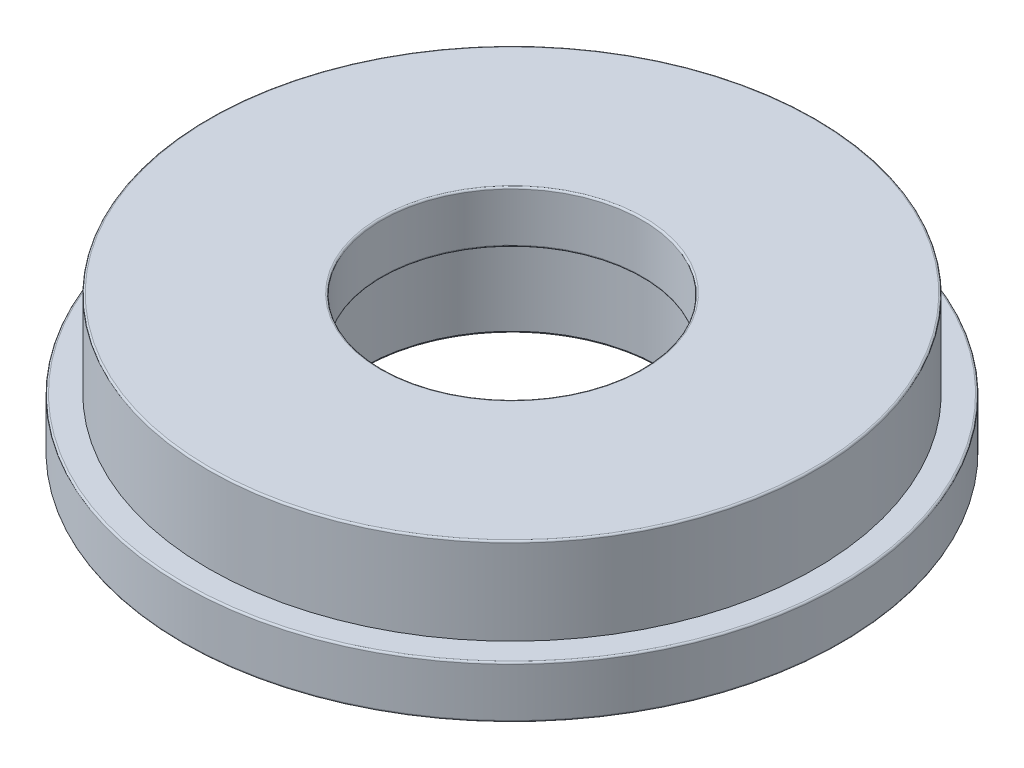
ISO-10303-21;
HEADER;
FILE_DESCRIPTION(('STEP AP214'),'2;1');
FILE_NAME('part.step','',(''),(''),'','','');
FILE_SCHEMA(('AUTOMOTIVE_DESIGN { 1 0 10303 214 1 1 1 1 }'));
ENDSEC;
DATA;
#1=APPLICATION_CONTEXT('core data for automotive mechanical design processes');
#2=APPLICATION_PROTOCOL_DEFINITION('international standard','automotive_design',2000,#1);
#3=PRODUCT_CONTEXT('',#1,'mechanical');
#4=PRODUCT('Part','Part','',(#3));
#5=PRODUCT_RELATED_PRODUCT_CATEGORY('part','',(#4));
#6=PRODUCT_DEFINITION_FORMATION('','',#4);
#7=PRODUCT_DEFINITION_CONTEXT('part definition',#1,'design');
#8=PRODUCT_DEFINITION('design','',#6,#7);
#9=PRODUCT_DEFINITION_SHAPE('','',#8);
#10=(LENGTH_UNIT() NAMED_UNIT(*) SI_UNIT(.MILLI.,.METRE.));
#11=(NAMED_UNIT(*) PLANE_ANGLE_UNIT() SI_UNIT($,.RADIAN.));
#12=(NAMED_UNIT(*) SI_UNIT($,.STERADIAN.) SOLID_ANGLE_UNIT());
#13=UNCERTAINTY_MEASURE_WITH_UNIT(LENGTH_MEASURE(1.E-05),#10,'distance_accuracy_value','');
#14=(GEOMETRIC_REPRESENTATION_CONTEXT(3) GLOBAL_UNCERTAINTY_ASSIGNED_CONTEXT((#13)) GLOBAL_UNIT_ASSIGNED_CONTEXT((#10,
#11,#12)) REPRESENTATION_CONTEXT('',''));
#15=CARTESIAN_POINT('',(0.,0.,0.));
#16=DIRECTION('',(0.,0.,1.));
#17=DIRECTION('',(1.,0.,0.));
#18=AXIS2_PLACEMENT_3D('',#15,#16,#17);
#19=CARTESIAN_POINT('',(0.,3.,0.));
#20=DIRECTION('',(0.,-1.,0.));
#21=DIRECTION('',(0.,0.,-1.));
#22=AXIS2_PLACEMENT_3D('',#19,#20,#21);
#23=CYLINDRICAL_SURFACE('',#22,19.);
#24=CARTESIAN_POINT('',(0.,0.0999999999999998,0.));
#25=DIRECTION('',(0.,1.,0.));
#26=DIRECTION('',(0.,0.,1.));
#27=AXIS2_PLACEMENT_3D('',#24,#25,#26);
#28=CIRCLE('',#27,19.);
#29=CARTESIAN_POINT('',(0.,0.0999999999999998,19.));
#30=VERTEX_POINT('',#29);
#31=EDGE_CURVE('E46',#30,#30,#28,.T.);
#32=ORIENTED_EDGE('',*,*,#31,.T.);
#33=EDGE_LOOP('',(#32));
#34=FACE_BOUND('',#33,.T.);
#35=CARTESIAN_POINT('',(0.,2.9,0.));
#36=DIRECTION('',(0.,1.,0.));
#37=DIRECTION('',(0.,0.,1.));
#38=AXIS2_PLACEMENT_3D('',#35,#36,#37);
#39=CIRCLE('',#38,19.);
#40=CARTESIAN_POINT('',(0.,2.9,19.));
#41=VERTEX_POINT('',#40);
#42=EDGE_CURVE('E50',#41,#41,#39,.F.);
#43=ORIENTED_EDGE('',*,*,#42,.T.);
#44=EDGE_LOOP('',(#43));
#45=FACE_BOUND('',#44,.T.);
#46=ADVANCED_FACE('F39',(#34,#45),#23,.T.);
#47=CARTESIAN_POINT('',(0.,3.,0.));
#48=DIRECTION('',(0.,1.,0.));
#49=DIRECTION('',(0.,0.,1.));
#50=AXIS2_PLACEMENT_3D('',#47,#48,#49);
#51=PLANE('',#50);
#52=CARTESIAN_POINT('',(0.,3.,0.));
#53=DIRECTION('',(0.,1.,0.));
#54=DIRECTION('',(0.,0.,1.));
#55=AXIS2_PLACEMENT_3D('',#52,#53,#54);
#56=CIRCLE('',#55,18.9);
#57=CARTESIAN_POINT('',(0.,3.,18.9));
#58=VERTEX_POINT('',#57);
#59=EDGE_CURVE('E11',#58,#58,#56,.T.);
#60=ORIENTED_EDGE('',*,*,#59,.T.);
#61=EDGE_LOOP('',(#60));
#62=FACE_BOUND('',#61,.T.);
#63=CARTESIAN_POINT('',(0.,3.,0.));
#64=DIRECTION('',(0.,1.,0.));
#65=DIRECTION('',(0.,0.,1.));
#66=AXIS2_PLACEMENT_3D('',#63,#64,#65);
#67=CIRCLE('',#66,17.5);
#68=CARTESIAN_POINT('',(0.,3.,17.5));
#69=VERTEX_POINT('',#68);
#70=EDGE_CURVE('E127',#69,#69,#67,.T.);
#71=ORIENTED_EDGE('',*,*,#70,.F.);
#72=EDGE_LOOP('',(#71));
#73=FACE_BOUND('',#72,.T.);
#74=ADVANCED_FACE('F162',(#62,#73),#51,.T.);
#75=CARTESIAN_POINT('',(0.,0.,0.));
#76=DIRECTION('',(0.,1.,0.));
#77=DIRECTION('',(0.,0.,1.));
#78=AXIS2_PLACEMENT_3D('',#75,#76,#77);
#79=PLANE('',#78);
#80=CARTESIAN_POINT('',(-12.9903810567666,0.,-7.49999999999999));
#81=DIRECTION('',(0.,1.,0.));
#82=DIRECTION('',(0.,0.,1.));
#83=AXIS2_PLACEMENT_3D('',#80,#81,#82);
#84=CIRCLE('',#83,3.15);
#85=CARTESIAN_POINT('',(-12.9903810567666,0.,-4.34999999999999));
#86=VERTEX_POINT('',#85);
#87=EDGE_CURVE('E86',#86,#86,#84,.T.);
#88=ORIENTED_EDGE('',*,*,#87,.T.);
#89=EDGE_LOOP('',(#88));
#90=FACE_BOUND('',#89,.T.);
#91=CARTESIAN_POINT('',(-12.9903810567666,0.,7.50000000000001));
#92=DIRECTION('',(0.,1.,0.));
#93=DIRECTION('',(0.,0.,1.));
#94=AXIS2_PLACEMENT_3D('',#91,#92,#93);
#95=CIRCLE('',#94,3.15);
#96=CARTESIAN_POINT('',(-12.9903810567666,0.,10.65));
#97=VERTEX_POINT('',#96);
#98=EDGE_CURVE('E89',#97,#97,#95,.T.);
#99=ORIENTED_EDGE('',*,*,#98,.T.);
#100=EDGE_LOOP('',(#99));
#101=FACE_BOUND('',#100,.T.);
#102=CARTESIAN_POINT('',(0.,0.,15.));
#103=DIRECTION('',(0.,1.,0.));
#104=DIRECTION('',(0.,0.,1.));
#105=AXIS2_PLACEMENT_3D('',#102,#103,#104);
#106=CIRCLE('',#105,3.15);
#107=CARTESIAN_POINT('',(0.,0.,18.15));
#108=VERTEX_POINT('',#107);
#109=EDGE_CURVE('E92',#108,#108,#106,.T.);
#110=ORIENTED_EDGE('',*,*,#109,.T.);
#111=EDGE_LOOP('',(#110));
#112=FACE_BOUND('',#111,.T.);
#113=CARTESIAN_POINT('',(12.9903810567666,0.,7.5));
#114=DIRECTION('',(0.,1.,0.));
#115=DIRECTION('',(0.,0.,1.));
#116=AXIS2_PLACEMENT_3D('',#113,#114,#115);
#117=CIRCLE('',#116,3.15);
#118=CARTESIAN_POINT('',(12.9903810567666,0.,10.65));
#119=VERTEX_POINT('',#118);
#120=EDGE_CURVE('E95',#119,#119,#117,.T.);
#121=ORIENTED_EDGE('',*,*,#120,.T.);
#122=EDGE_LOOP('',(#121));
#123=FACE_BOUND('',#122,.T.);
#124=CARTESIAN_POINT('',(12.9903810567666,0.,-7.50000000000001));
#125=DIRECTION('',(0.,1.,0.));
#126=DIRECTION('',(0.,0.,1.));
#127=AXIS2_PLACEMENT_3D('',#124,#125,#126);
#128=CIRCLE('',#127,3.15);
#129=CARTESIAN_POINT('',(12.9903810567666,0.,-4.35));
#130=VERTEX_POINT('',#129);
#131=EDGE_CURVE('E98',#130,#130,#128,.T.);
#132=ORIENTED_EDGE('',*,*,#131,.T.);
#133=EDGE_LOOP('',(#132));
#134=FACE_BOUND('',#133,.T.);
#135=CARTESIAN_POINT('',(0.,0.,-15.));
#136=DIRECTION('',(0.,1.,0.));
#137=DIRECTION('',(0.,0.,1.));
#138=AXIS2_PLACEMENT_3D('',#135,#136,#137);
#139=CIRCLE('',#138,3.15);
#140=CARTESIAN_POINT('',(0.,0.,-11.85));
#141=VERTEX_POINT('',#140);
#142=EDGE_CURVE('E101',#141,#141,#139,.T.);
#143=ORIENTED_EDGE('',*,*,#142,.T.);
#144=EDGE_LOOP('',(#143));
#145=FACE_BOUND('',#144,.T.);
#146=CARTESIAN_POINT('',(0.,0.,0.));
#147=DIRECTION('',(0.,1.,0.));
#148=DIRECTION('',(0.,0.,1.));
#149=AXIS2_PLACEMENT_3D('',#146,#147,#148);
#150=CIRCLE('',#149,8.6);
#151=CARTESIAN_POINT('',(0.,0.,8.6));
#152=VERTEX_POINT('',#151);
#153=EDGE_CURVE('E104',#152,#152,#150,.T.);
#154=ORIENTED_EDGE('',*,*,#153,.T.);
#155=EDGE_LOOP('',(#154));
#156=FACE_BOUND('',#155,.T.);
#157=CARTESIAN_POINT('',(0.,0.,0.));
#158=DIRECTION('',(0.,1.,0.));
#159=DIRECTION('',(0.,0.,1.));
#160=AXIS2_PLACEMENT_3D('',#157,#158,#159);
#161=CIRCLE('',#160,18.9);
#162=CARTESIAN_POINT('',(0.,0.,18.9));
#163=VERTEX_POINT('',#162);
#164=EDGE_CURVE('E107',#163,#163,#161,.F.);
#165=ORIENTED_EDGE('',*,*,#164,.T.);
#166=EDGE_LOOP('',(#165));
#167=FACE_BOUND('',#166,.T.);
#168=ADVANCED_FACE('F167',(#90,#101,#112,#123,#134,#145,#156,#167),#79,.F.);
#169=CARTESIAN_POINT('',(-12.9903810567666,1.7,-7.49999999999999));
#170=DIRECTION('',(0.,-1.,0.));
#171=DIRECTION('',(0.,0.,-1.));
#172=AXIS2_PLACEMENT_3D('',#169,#170,#171);
#173=CYLINDRICAL_SURFACE('',#172,3.05);
#174=CARTESIAN_POINT('',(-12.9903810567666,0.1,-7.49999999999999));
#175=DIRECTION('',(0.,1.,0.));
#176=DIRECTION('',(0.,0.,1.));
#177=AXIS2_PLACEMENT_3D('',#174,#175,#176);
#178=CIRCLE('',#177,3.05);
#179=CARTESIAN_POINT('',(-12.9903810567666,0.1,-4.44999999999999));
#180=VERTEX_POINT('',#179);
#181=EDGE_CURVE('E83',#180,#180,#178,.F.);
#182=ORIENTED_EDGE('',*,*,#181,.T.);
#183=EDGE_LOOP('',(#182));
#184=FACE_BOUND('',#183,.T.);
#185=CARTESIAN_POINT('',(-12.9903810567666,1.7,-7.49999999999999));
#186=DIRECTION('',(0.,1.,0.));
#187=DIRECTION('',(0.,0.,1.));
#188=AXIS2_PLACEMENT_3D('',#185,#186,#187);
#189=CIRCLE('',#188,3.05);
#190=CARTESIAN_POINT('',(-12.9903810567666,1.7,-4.44999999999999));
#191=VERTEX_POINT('',#190);
#192=EDGE_CURVE('E119',#191,#191,#189,.T.);
#193=ORIENTED_EDGE('',*,*,#192,.T.);
#194=EDGE_LOOP('',(#193));
#195=FACE_BOUND('',#194,.T.);
#196=ADVANCED_FACE('F217',(#184,#195),#173,.F.);
#197=CARTESIAN_POINT('',(0.,1.7,0.));
#198=DIRECTION('',(0.,1.,0.));
#199=DIRECTION('',(0.,0.,1.));
#200=AXIS2_PLACEMENT_3D('',#197,#198,#199);
#201=PLANE('',#200);
#202=ORIENTED_EDGE('',*,*,#192,.F.);
#203=EDGE_LOOP('',(#202));
#204=FACE_BOUND('',#203,.T.);
#205=ADVANCED_FACE('F222',(#204),#201,.F.);
#206=CARTESIAN_POINT('',(-12.9903810567666,1.7,7.50000000000001));
#207=DIRECTION('',(0.,-1.,0.));
#208=DIRECTION('',(0.,0.,-1.));
#209=AXIS2_PLACEMENT_3D('',#206,#207,#208);
#210=CYLINDRICAL_SURFACE('',#209,3.05);
#211=CARTESIAN_POINT('',(-12.9903810567666,0.1,7.50000000000001));
#212=DIRECTION('',(0.,1.,0.));
#213=DIRECTION('',(0.,0.,1.));
#214=AXIS2_PLACEMENT_3D('',#211,#212,#213);
#215=CIRCLE('',#214,3.05);
#216=CARTESIAN_POINT('',(-12.9903810567666,0.1,10.55));
#217=VERTEX_POINT('',#216);
#218=EDGE_CURVE('E80',#217,#217,#215,.F.);
#219=ORIENTED_EDGE('',*,*,#218,.T.);
#220=EDGE_LOOP('',(#219));
#221=FACE_BOUND('',#220,.T.);
#222=CARTESIAN_POINT('',(-12.9903810567666,1.7,7.50000000000001));
#223=DIRECTION('',(0.,1.,0.));
#224=DIRECTION('',(0.,0.,1.));
#225=AXIS2_PLACEMENT_3D('',#222,#223,#224);
#226=CIRCLE('',#225,3.05);
#227=CARTESIAN_POINT('',(-12.9903810567666,1.7,10.55));
#228=VERTEX_POINT('',#227);
#229=EDGE_CURVE('E122',#228,#228,#226,.T.);
#230=ORIENTED_EDGE('',*,*,#229,.T.);
#231=EDGE_LOOP('',(#230));
#232=FACE_BOUND('',#231,.T.);
#233=ADVANCED_FACE('F249',(#221,#232),#210,.F.);
#234=CARTESIAN_POINT('',(0.,1.7,0.));
#235=DIRECTION('',(0.,1.,0.));
#236=DIRECTION('',(0.,0.,1.));
#237=AXIS2_PLACEMENT_3D('',#234,#235,#236);
#238=PLANE('',#237);
#239=ORIENTED_EDGE('',*,*,#229,.F.);
#240=EDGE_LOOP('',(#239));
#241=FACE_BOUND('',#240,.T.);
#242=ADVANCED_FACE('F283',(#241),#238,.F.);
#243=CARTESIAN_POINT('',(0.,1.7,15.));
#244=DIRECTION('',(0.,-1.,0.));
#245=DIRECTION('',(0.,0.,-1.));
#246=AXIS2_PLACEMENT_3D('',#243,#244,#245);
#247=CYLINDRICAL_SURFACE('',#246,3.05);
#248=CARTESIAN_POINT('',(0.,0.1,15.));
#249=DIRECTION('',(0.,1.,0.));
#250=DIRECTION('',(0.,0.,1.));
#251=AXIS2_PLACEMENT_3D('',#248,#249,#250);
#252=CIRCLE('',#251,3.05);
#253=CARTESIAN_POINT('',(0.,0.1,18.05));
#254=VERTEX_POINT('',#253);
#255=EDGE_CURVE('E77',#254,#254,#252,.F.);
#256=ORIENTED_EDGE('',*,*,#255,.T.);
#257=EDGE_LOOP('',(#256));
#258=FACE_BOUND('',#257,.T.);
#259=CARTESIAN_POINT('',(0.,1.7,15.));
#260=DIRECTION('',(0.,1.,0.));
#261=DIRECTION('',(0.,0.,1.));
#262=AXIS2_PLACEMENT_3D('',#259,#260,#261);
#263=CIRCLE('',#262,3.05);
#264=CARTESIAN_POINT('',(0.,1.7,18.05));
#265=VERTEX_POINT('',#264);
#266=EDGE_CURVE('E133',#265,#265,#263,.T.);
#267=ORIENTED_EDGE('',*,*,#266,.T.);
#268=EDGE_LOOP('',(#267));
#269=FACE_BOUND('',#268,.T.);
#270=ADVANCED_FACE('F280',(#258,#269),#247,.F.);
#271=CARTESIAN_POINT('',(0.,1.7,0.));
#272=DIRECTION('',(0.,1.,0.));
#273=DIRECTION('',(0.,0.,1.));
#274=AXIS2_PLACEMENT_3D('',#271,#272,#273);
#275=PLANE('',#274);
#276=ORIENTED_EDGE('',*,*,#266,.F.);
#277=EDGE_LOOP('',(#276));
#278=FACE_BOUND('',#277,.T.);
#279=ADVANCED_FACE('F275',(#278),#275,.F.);
#280=CARTESIAN_POINT('',(12.9903810567666,1.7,7.5));
#281=DIRECTION('',(0.,-1.,0.));
#282=DIRECTION('',(0.,0.,-1.));
#283=AXIS2_PLACEMENT_3D('',#280,#281,#282);
#284=CYLINDRICAL_SURFACE('',#283,3.05);
#285=CARTESIAN_POINT('',(12.9903810567666,0.1,7.5));
#286=DIRECTION('',(0.,1.,0.));
#287=DIRECTION('',(0.,0.,1.));
#288=AXIS2_PLACEMENT_3D('',#285,#286,#287);
#289=CIRCLE('',#288,3.05);
#290=CARTESIAN_POINT('',(12.9903810567666,0.1,10.55));
#291=VERTEX_POINT('',#290);
#292=EDGE_CURVE('E74',#291,#291,#289,.F.);
#293=ORIENTED_EDGE('',*,*,#292,.T.);
#294=EDGE_LOOP('',(#293));
#295=FACE_BOUND('',#294,.T.);
#296=CARTESIAN_POINT('',(12.9903810567666,1.7,7.5));
#297=DIRECTION('',(0.,1.,0.));
#298=DIRECTION('',(0.,0.,1.));
#299=AXIS2_PLACEMENT_3D('',#296,#297,#298);
#300=CIRCLE('',#299,3.05);
#301=CARTESIAN_POINT('',(12.9903810567666,1.7,10.55));
#302=VERTEX_POINT('',#301);
#303=EDGE_CURVE('E130',#302,#302,#300,.T.);
#304=ORIENTED_EDGE('',*,*,#303,.T.);
#305=EDGE_LOOP('',(#304));
#306=FACE_BOUND('',#305,.T.);
#307=ADVANCED_FACE('F272',(#295,#306),#284,.F.);
#308=CARTESIAN_POINT('',(0.,1.7,0.));
#309=DIRECTION('',(0.,1.,0.));
#310=DIRECTION('',(0.,0.,1.));
#311=AXIS2_PLACEMENT_3D('',#308,#309,#310);
#312=PLANE('',#311);
#313=ORIENTED_EDGE('',*,*,#303,.F.);
#314=EDGE_LOOP('',(#313));
#315=FACE_BOUND('',#314,.T.);
#316=ADVANCED_FACE('F267',(#315),#312,.F.);
#317=CARTESIAN_POINT('',(12.9903810567666,1.7,-7.50000000000001));
#318=DIRECTION('',(0.,-1.,0.));
#319=DIRECTION('',(0.,0.,-1.));
#320=AXIS2_PLACEMENT_3D('',#317,#318,#319);
#321=CYLINDRICAL_SURFACE('',#320,3.05);
#322=CARTESIAN_POINT('',(12.9903810567666,0.1,-7.50000000000001));
#323=DIRECTION('',(0.,1.,0.));
#324=DIRECTION('',(0.,0.,1.));
#325=AXIS2_PLACEMENT_3D('',#322,#323,#324);
#326=CIRCLE('',#325,3.05);
#327=CARTESIAN_POINT('',(12.9903810567666,0.1,-4.45000000000001));
#328=VERTEX_POINT('',#327);
#329=EDGE_CURVE('E71',#328,#328,#326,.F.);
#330=ORIENTED_EDGE('',*,*,#329,.T.);
#331=EDGE_LOOP('',(#330));
#332=FACE_BOUND('',#331,.T.);
#333=CARTESIAN_POINT('',(12.9903810567666,1.7,-7.50000000000001));
#334=DIRECTION('',(0.,1.,0.));
#335=DIRECTION('',(0.,0.,1.));
#336=AXIS2_PLACEMENT_3D('',#333,#334,#335);
#337=CIRCLE('',#336,3.05);
#338=CARTESIAN_POINT('',(12.9903810567666,1.7,-4.45000000000001));
#339=VERTEX_POINT('',#338);
#340=EDGE_CURVE('E126',#339,#339,#337,.T.);
#341=ORIENTED_EDGE('',*,*,#340,.T.);
#342=EDGE_LOOP('',(#341));
#343=FACE_BOUND('',#342,.T.);
#344=ADVANCED_FACE('F264',(#332,#343),#321,.F.);
#345=CARTESIAN_POINT('',(0.,1.7,0.));
#346=DIRECTION('',(0.,1.,0.));
#347=DIRECTION('',(0.,0.,1.));
#348=AXIS2_PLACEMENT_3D('',#345,#346,#347);
#349=PLANE('',#348);
#350=ORIENTED_EDGE('',*,*,#340,.F.);
#351=EDGE_LOOP('',(#350));
#352=FACE_BOUND('',#351,.T.);
#353=ADVANCED_FACE('F258',(#352),#349,.F.);
#354=CARTESIAN_POINT('',(0.,1.7,-15.));
#355=DIRECTION('',(0.,-1.,0.));
#356=DIRECTION('',(0.,0.,-1.));
#357=AXIS2_PLACEMENT_3D('',#354,#355,#356);
#358=CYLINDRICAL_SURFACE('',#357,3.05);
#359=CARTESIAN_POINT('',(0.,0.1,-15.));
#360=DIRECTION('',(0.,1.,0.));
#361=DIRECTION('',(0.,0.,1.));
#362=AXIS2_PLACEMENT_3D('',#359,#360,#361);
#363=CIRCLE('',#362,3.05);
#364=CARTESIAN_POINT('',(0.,0.1,-11.95));
#365=VERTEX_POINT('',#364);
#366=EDGE_CURVE('E68',#365,#365,#363,.F.);
#367=ORIENTED_EDGE('',*,*,#366,.T.);
#368=EDGE_LOOP('',(#367));
#369=FACE_BOUND('',#368,.T.);
#370=CARTESIAN_POINT('',(0.,1.7,-15.));
#371=DIRECTION('',(0.,1.,0.));
#372=DIRECTION('',(0.,0.,1.));
#373=AXIS2_PLACEMENT_3D('',#370,#371,#372);
#374=CIRCLE('',#373,3.05);
#375=CARTESIAN_POINT('',(0.,1.7,-11.95));
#376=VERTEX_POINT('',#375);
#377=EDGE_CURVE('E123',#376,#376,#374,.T.);
#378=ORIENTED_EDGE('',*,*,#377,.T.);
#379=EDGE_LOOP('',(#378));
#380=FACE_BOUND('',#379,.T.);
#381=ADVANCED_FACE('F254',(#369,#380),#358,.F.);
#382=CARTESIAN_POINT('',(0.,1.7,0.));
#383=DIRECTION('',(0.,1.,0.));
#384=DIRECTION('',(0.,0.,1.));
#385=AXIS2_PLACEMENT_3D('',#382,#383,#384);
#386=PLANE('',#385);
#387=ORIENTED_EDGE('',*,*,#377,.F.);
#388=EDGE_LOOP('',(#387));
#389=FACE_BOUND('',#388,.T.);
#390=ADVANCED_FACE('F257',(#389),#386,.F.);
#391=CARTESIAN_POINT('',(0.,8.,0.));
#392=DIRECTION('',(0.,1.,0.));
#393=DIRECTION('',(0.,0.,1.));
#394=AXIS2_PLACEMENT_3D('',#391,#392,#393);
#395=PLANE('',#394);
#396=CARTESIAN_POINT('',(0.,8.,0.));
#397=DIRECTION('',(0.,1.,0.));
#398=DIRECTION('',(0.,0.,1.));
#399=AXIS2_PLACEMENT_3D('',#396,#397,#398);
#400=CIRCLE('',#399,7.6);
#401=CARTESIAN_POINT('',(0.,8.,7.6));
#402=VERTEX_POINT('',#401);
#403=EDGE_CURVE('E59',#402,#402,#400,.F.);
#404=ORIENTED_EDGE('',*,*,#403,.T.);
#405=EDGE_LOOP('',(#404));
#406=FACE_BOUND('',#405,.T.);
#407=CARTESIAN_POINT('',(0.,8.,0.));
#408=DIRECTION('',(0.,1.,0.));
#409=DIRECTION('',(0.,0.,1.));
#410=AXIS2_PLACEMENT_3D('',#407,#408,#409);
#411=CIRCLE('',#410,17.4);
#412=CARTESIAN_POINT('',(0.,8.,17.4));
#413=VERTEX_POINT('',#412);
#414=EDGE_CURVE('E62',#413,#413,#411,.T.);
#415=ORIENTED_EDGE('',*,*,#414,.T.);
#416=EDGE_LOOP('',(#415));
#417=FACE_BOUND('',#416,.T.);
#418=ADVANCED_FACE('F262',(#406,#417),#395,.T.);
#419=CARTESIAN_POINT('',(0.,8.,0.));
#420=DIRECTION('',(0.,-1.,0.));
#421=DIRECTION('',(0.,0.,-1.));
#422=AXIS2_PLACEMENT_3D('',#419,#420,#421);
#423=CYLINDRICAL_SURFACE('',#422,17.5);
#424=CARTESIAN_POINT('',(0.,7.9,0.));
#425=DIRECTION('',(0.,1.,0.));
#426=DIRECTION('',(0.,0.,1.));
#427=AXIS2_PLACEMENT_3D('',#424,#425,#426);
#428=CIRCLE('',#427,17.5);
#429=CARTESIAN_POINT('',(0.,7.9,17.5));
#430=VERTEX_POINT('',#429);
#431=EDGE_CURVE('E54',#430,#430,#428,.F.);
#432=ORIENTED_EDGE('',*,*,#431,.T.);
#433=EDGE_LOOP('',(#432));
#434=FACE_BOUND('',#433,.T.);
#435=ORIENTED_EDGE('',*,*,#70,.T.);
#436=EDGE_LOOP('',(#435));
#437=FACE_BOUND('',#436,.T.);
#438=ADVANCED_FACE('F294',(#434,#437),#423,.T.);
#439=CARTESIAN_POINT('',(0.,8.,0.));
#440=DIRECTION('',(0.,-1.,0.));
#441=DIRECTION('',(0.,0.,-1.));
#442=AXIS2_PLACEMENT_3D('',#439,#440,#441);
#443=CYLINDRICAL_SURFACE('',#442,7.5);
#444=CARTESIAN_POINT('',(0.,5.1,0.));
#445=DIRECTION('',(0.,1.,0.));
#446=DIRECTION('',(0.,0.,1.));
#447=AXIS2_PLACEMENT_3D('',#444,#445,#446);
#448=CIRCLE('',#447,7.5);
#449=CARTESIAN_POINT('',(0.,5.1,7.5));
#450=VERTEX_POINT('',#449);
#451=EDGE_CURVE('E110',#450,#450,#448,.F.);
#452=ORIENTED_EDGE('',*,*,#451,.T.);
#453=EDGE_LOOP('',(#452));
#454=FACE_BOUND('',#453,.T.);
#455=CARTESIAN_POINT('',(0.,7.9,0.));
#456=DIRECTION('',(0.,1.,0.));
#457=DIRECTION('',(0.,0.,1.));
#458=AXIS2_PLACEMENT_3D('',#455,#456,#457);
#459=CIRCLE('',#458,7.5);
#460=CARTESIAN_POINT('',(0.,7.9,7.5));
#461=VERTEX_POINT('',#460);
#462=EDGE_CURVE('E113',#461,#461,#459,.T.);
#463=ORIENTED_EDGE('',*,*,#462,.T.);
#464=EDGE_LOOP('',(#463));
#465=FACE_BOUND('',#464,.T.);
#466=ADVANCED_FACE('F158',(#454,#465),#443,.F.);
#467=CARTESIAN_POINT('',(0.,5.,0.));
#468=DIRECTION('',(0.,1.,0.));
#469=DIRECTION('',(0.,0.,1.));
#470=AXIS2_PLACEMENT_3D('',#467,#468,#469);
#471=PLANE('',#470);
#472=CARTESIAN_POINT('',(0.,5.,0.));
#473=DIRECTION('',(0.,1.,0.));
#474=DIRECTION('',(0.,0.,1.));
#475=AXIS2_PLACEMENT_3D('',#472,#473,#474);
#476=CIRCLE('',#475,7.6);
#477=CARTESIAN_POINT('',(0.,5.,7.6));
#478=VERTEX_POINT('',#477);
#479=EDGE_CURVE('E116',#478,#478,#476,.T.);
#480=ORIENTED_EDGE('',*,*,#479,.T.);
#481=EDGE_LOOP('',(#480));
#482=FACE_BOUND('',#481,.T.);
#483=CARTESIAN_POINT('',(0.,5.,0.));
#484=DIRECTION('',(0.,1.,0.));
#485=DIRECTION('',(0.,0.,1.));
#486=AXIS2_PLACEMENT_3D('',#483,#484,#485);
#487=CIRCLE('',#486,8.5);
#488=CARTESIAN_POINT('',(0.,5.,8.5));
#489=VERTEX_POINT('',#488);
#490=EDGE_CURVE('E140',#489,#489,#487,.F.);
#491=ORIENTED_EDGE('',*,*,#490,.T.);
#492=EDGE_LOOP('',(#491));
#493=FACE_BOUND('',#492,.T.);
#494=ADVANCED_FACE('F144',(#482,#493),#471,.F.);
#495=CARTESIAN_POINT('',(0.,32.0416305603426,0.));
#496=DIRECTION('',(0.,-1.,0.));
#497=DIRECTION('',(0.,0.,-1.));
#498=AXIS2_PLACEMENT_3D('',#495,#496,#497);
#499=CYLINDRICAL_SURFACE('',#498,8.5);
#500=CARTESIAN_POINT('',(0.,0.100000000000003,0.));
#501=DIRECTION('',(0.,1.,0.));
#502=DIRECTION('',(0.,0.,1.));
#503=AXIS2_PLACEMENT_3D('',#500,#501,#502);
#504=CIRCLE('',#503,8.5);
#505=CARTESIAN_POINT('',(0.,0.100000000000003,8.5));
#506=VERTEX_POINT('',#505);
#507=EDGE_CURVE('E65',#506,#506,#504,.F.);
#508=ORIENTED_EDGE('',*,*,#507,.T.);
#509=EDGE_LOOP('',(#508));
#510=FACE_BOUND('',#509,.T.);
#511=ORIENTED_EDGE('',*,*,#490,.F.);
#512=EDGE_LOOP('',(#511));
#513=FACE_BOUND('',#512,.T.);
#514=ADVANCED_FACE('F146',(#510,#513),#499,.F.);
#515=CARTESIAN_POINT('',(0.,5.1,0.));
#516=DIRECTION('',(0.,1.,0.));
#517=DIRECTION('',(0.,0.,1.));
#518=AXIS2_PLACEMENT_3D('',#515,#516,#517);
#519=TOROIDAL_SURFACE('',#518,7.6,0.1);
#520=ORIENTED_EDGE('',*,*,#451,.F.);
#521=EDGE_LOOP('',(#520));
#522=FACE_BOUND('',#521,.T.);
#523=ORIENTED_EDGE('',*,*,#479,.F.);
#524=EDGE_LOOP('',(#523));
#525=FACE_BOUND('',#524,.T.);
#526=ADVANCED_FACE('F148',(#522,#525),#519,.T.);
#527=CARTESIAN_POINT('',(-12.9903810567666,0.1,-7.49999999999999));
#528=DIRECTION('',(0.,1.,0.));
#529=DIRECTION('',(0.,0.,1.));
#530=AXIS2_PLACEMENT_3D('',#527,#528,#529);
#531=TOROIDAL_SURFACE('',#530,3.15,0.1);
#532=ORIENTED_EDGE('',*,*,#181,.F.);
#533=EDGE_LOOP('',(#532));
#534=FACE_BOUND('',#533,.T.);
#535=ORIENTED_EDGE('',*,*,#87,.F.);
#536=EDGE_LOOP('',(#535));
#537=FACE_BOUND('',#536,.T.);
#538=ADVANCED_FACE('F155',(#534,#537),#531,.T.);
#539=CARTESIAN_POINT('',(-12.9903810567666,0.1,7.50000000000001));
#540=DIRECTION('',(0.,1.,0.));
#541=DIRECTION('',(0.,0.,1.));
#542=AXIS2_PLACEMENT_3D('',#539,#540,#541);
#543=TOROIDAL_SURFACE('',#542,3.15,0.1);
#544=ORIENTED_EDGE('',*,*,#218,.F.);
#545=EDGE_LOOP('',(#544));
#546=FACE_BOUND('',#545,.T.);
#547=ORIENTED_EDGE('',*,*,#98,.F.);
#548=EDGE_LOOP('',(#547));
#549=FACE_BOUND('',#548,.T.);
#550=ADVANCED_FACE('F174',(#546,#549),#543,.T.);
#551=CARTESIAN_POINT('',(0.,0.1,15.));
#552=DIRECTION('',(0.,1.,0.));
#553=DIRECTION('',(0.,0.,1.));
#554=AXIS2_PLACEMENT_3D('',#551,#552,#553);
#555=TOROIDAL_SURFACE('',#554,3.15,0.1);
#556=ORIENTED_EDGE('',*,*,#255,.F.);
#557=EDGE_LOOP('',(#556));
#558=FACE_BOUND('',#557,.T.);
#559=ORIENTED_EDGE('',*,*,#109,.F.);
#560=EDGE_LOOP('',(#559));
#561=FACE_BOUND('',#560,.T.);
#562=ADVANCED_FACE('F178',(#558,#561),#555,.T.);
#563=CARTESIAN_POINT('',(12.9903810567666,0.1,7.5));
#564=DIRECTION('',(0.,1.,0.));
#565=DIRECTION('',(0.,0.,1.));
#566=AXIS2_PLACEMENT_3D('',#563,#564,#565);
#567=TOROIDAL_SURFACE('',#566,3.15,0.1);
#568=ORIENTED_EDGE('',*,*,#292,.F.);
#569=EDGE_LOOP('',(#568));
#570=FACE_BOUND('',#569,.T.);
#571=ORIENTED_EDGE('',*,*,#120,.F.);
#572=EDGE_LOOP('',(#571));
#573=FACE_BOUND('',#572,.T.);
#574=ADVANCED_FACE('F182',(#570,#573),#567,.T.);
#575=CARTESIAN_POINT('',(12.9903810567666,0.1,-7.50000000000001));
#576=DIRECTION('',(0.,1.,0.));
#577=DIRECTION('',(0.,0.,1.));
#578=AXIS2_PLACEMENT_3D('',#575,#576,#577);
#579=TOROIDAL_SURFACE('',#578,3.15,0.1);
#580=ORIENTED_EDGE('',*,*,#329,.F.);
#581=EDGE_LOOP('',(#580));
#582=FACE_BOUND('',#581,.T.);
#583=ORIENTED_EDGE('',*,*,#131,.F.);
#584=EDGE_LOOP('',(#583));
#585=FACE_BOUND('',#584,.T.);
#586=ADVANCED_FACE('F186',(#582,#585),#579,.T.);
#587=CARTESIAN_POINT('',(0.,0.1,-15.));
#588=DIRECTION('',(0.,1.,0.));
#589=DIRECTION('',(0.,0.,1.));
#590=AXIS2_PLACEMENT_3D('',#587,#588,#589);
#591=TOROIDAL_SURFACE('',#590,3.15,0.1);
#592=ORIENTED_EDGE('',*,*,#366,.F.);
#593=EDGE_LOOP('',(#592));
#594=FACE_BOUND('',#593,.T.);
#595=ORIENTED_EDGE('',*,*,#142,.F.);
#596=EDGE_LOOP('',(#595));
#597=FACE_BOUND('',#596,.T.);
#598=ADVANCED_FACE('F190',(#594,#597),#591,.T.);
#599=CARTESIAN_POINT('',(0.,0.100000000000003,0.));
#600=DIRECTION('',(0.,1.,0.));
#601=DIRECTION('',(0.,0.,1.));
#602=AXIS2_PLACEMENT_3D('',#599,#600,#601);
#603=TOROIDAL_SURFACE('',#602,8.6,0.1);
#604=ORIENTED_EDGE('',*,*,#153,.F.);
#605=EDGE_LOOP('',(#604));
#606=FACE_BOUND('',#605,.T.);
#607=ORIENTED_EDGE('',*,*,#507,.F.);
#608=EDGE_LOOP('',(#607));
#609=FACE_BOUND('',#608,.T.);
#610=ADVANCED_FACE('F194',(#606,#609),#603,.T.);
#611=CARTESIAN_POINT('',(0.,7.9,0.));
#612=DIRECTION('',(0.,1.,0.));
#613=DIRECTION('',(0.,0.,1.));
#614=AXIS2_PLACEMENT_3D('',#611,#612,#613);
#615=TOROIDAL_SURFACE('',#614,7.6,0.1);
#616=ORIENTED_EDGE('',*,*,#403,.F.);
#617=EDGE_LOOP('',(#616));
#618=FACE_BOUND('',#617,.T.);
#619=ORIENTED_EDGE('',*,*,#462,.F.);
#620=EDGE_LOOP('',(#619));
#621=FACE_BOUND('',#620,.T.);
#622=ADVANCED_FACE('F198',(#618,#621),#615,.T.);
#623=CARTESIAN_POINT('',(0.,7.9,0.));
#624=DIRECTION('',(0.,1.,0.));
#625=DIRECTION('',(0.,0.,1.));
#626=AXIS2_PLACEMENT_3D('',#623,#624,#625);
#627=TOROIDAL_SURFACE('',#626,17.4,0.1);
#628=ORIENTED_EDGE('',*,*,#431,.F.);
#629=EDGE_LOOP('',(#628));
#630=FACE_BOUND('',#629,.T.);
#631=ORIENTED_EDGE('',*,*,#414,.F.);
#632=EDGE_LOOP('',(#631));
#633=FACE_BOUND('',#632,.T.);
#634=ADVANCED_FACE('F202',(#630,#633),#627,.T.);
#635=CARTESIAN_POINT('',(0.,0.0999999999999998,0.));
#636=DIRECTION('',(0.,1.,0.));
#637=DIRECTION('',(0.,0.,1.));
#638=AXIS2_PLACEMENT_3D('',#635,#636,#637);
#639=TOROIDAL_SURFACE('',#638,18.9,0.1);
#640=ORIENTED_EDGE('',*,*,#164,.F.);
#641=EDGE_LOOP('',(#640));
#642=FACE_BOUND('',#641,.T.);
#643=ORIENTED_EDGE('',*,*,#31,.F.);
#644=EDGE_LOOP('',(#643));
#645=FACE_BOUND('',#644,.T.);
#646=ADVANCED_FACE('F205',(#642,#645),#639,.T.);
#647=CARTESIAN_POINT('',(0.,2.9,0.));
#648=DIRECTION('',(0.,1.,0.));
#649=DIRECTION('',(0.,0.,1.));
#650=AXIS2_PLACEMENT_3D('',#647,#648,#649);
#651=TOROIDAL_SURFACE('',#650,18.9,0.1);
#652=ORIENTED_EDGE('',*,*,#42,.F.);
#653=EDGE_LOOP('',(#652));
#654=FACE_BOUND('',#653,.T.);
#655=ORIENTED_EDGE('',*,*,#59,.F.);
#656=EDGE_LOOP('',(#655));
#657=FACE_BOUND('',#656,.T.);
#658=ADVANCED_FACE('F41',(#654,#657),#651,.T.);
#659=CLOSED_SHELL('',(#46,#74,#168,#196,#205,#233,#242,#270,#279,#307,#316,#344,#353,#381,#390,
#418,#438,#466,#494,#514,#526,#538,#550,#562,#574,#586,#598,#610,#622,#634,#646,#658));
#660=MANIFOLD_SOLID_BREP('B2',#659);
#661=ADVANCED_BREP_SHAPE_REPRESENTATION('',(#18,#660),#14);
#662=SHAPE_DEFINITION_REPRESENTATION(#9,#661);
ENDSEC;
END-ISO-10303-21;
